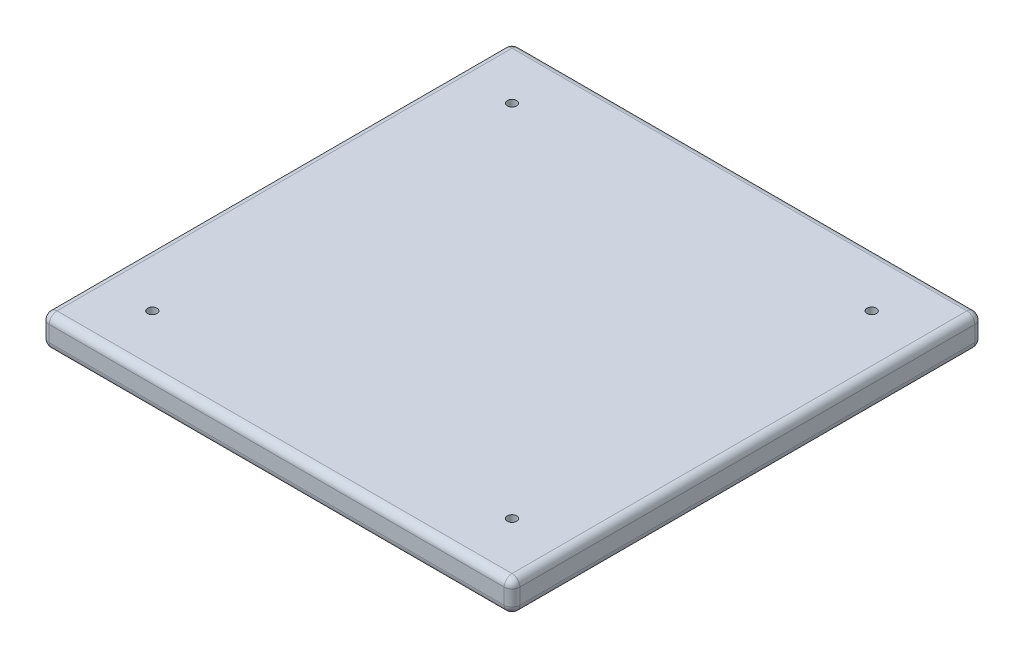
ISO-10303-21;
HEADER;
FILE_DESCRIPTION(('STEP AP214'),'2;1');
FILE_NAME('part.step','',(''),(''),'','','');
FILE_SCHEMA(('AUTOMOTIVE_DESIGN { 1 0 10303 214 1 1 1 1 }'));
ENDSEC;
DATA;
#1=APPLICATION_CONTEXT('core data for automotive mechanical design processes');
#2=APPLICATION_PROTOCOL_DEFINITION('international standard','automotive_design',2000,#1);
#3=PRODUCT_CONTEXT('',#1,'mechanical');
#4=PRODUCT('Part','Part','',(#3));
#5=PRODUCT_RELATED_PRODUCT_CATEGORY('part','',(#4));
#6=PRODUCT_DEFINITION_FORMATION('','',#4);
#7=PRODUCT_DEFINITION_CONTEXT('part definition',#1,'design');
#8=PRODUCT_DEFINITION('design','',#6,#7);
#9=PRODUCT_DEFINITION_SHAPE('','',#8);
#10=(LENGTH_UNIT() NAMED_UNIT(*) SI_UNIT(.MILLI.,.METRE.));
#11=(NAMED_UNIT(*) PLANE_ANGLE_UNIT() SI_UNIT($,.RADIAN.));
#12=(NAMED_UNIT(*) SI_UNIT($,.STERADIAN.) SOLID_ANGLE_UNIT());
#13=UNCERTAINTY_MEASURE_WITH_UNIT(LENGTH_MEASURE(1.E-05),#10,'distance_accuracy_value','');
#14=(GEOMETRIC_REPRESENTATION_CONTEXT(3) GLOBAL_UNCERTAINTY_ASSIGNED_CONTEXT((#13)) GLOBAL_UNIT_ASSIGNED_CONTEXT((#10,
#11,#12)) REPRESENTATION_CONTEXT('',''));
#15=CARTESIAN_POINT('',(0.,0.,0.));
#16=DIRECTION('',(0.,0.,1.));
#17=DIRECTION('',(1.,0.,0.));
#18=AXIS2_PLACEMENT_3D('',#15,#16,#17);
#19=CARTESIAN_POINT('',(75.,10.,-75.));
#20=DIRECTION('',(-1.,0.,0.));
#21=DIRECTION('',(0.,0.,1.));
#22=AXIS2_PLACEMENT_3D('',#19,#20,#21);
#23=PLANE('',#22);
#24=DIRECTION('',(0.,0.,-1.));
#25=VECTOR('',#24,1.);
#26=CARTESIAN_POINT('',(75.,7.5,75.));
#27=LINE('',#26,#25);
#28=CARTESIAN_POINT('',(75.,7.5,-72.5));
#29=VERTEX_POINT('',#28);
#30=CARTESIAN_POINT('',(75.,7.5,72.5));
#31=VERTEX_POINT('',#30);
#32=EDGE_CURVE('E59',#29,#31,#27,.F.);
#33=ORIENTED_EDGE('',*,*,#32,.T.);
#34=DIRECTION('',(0.,-1.,0.));
#35=VECTOR('',#34,1.);
#36=CARTESIAN_POINT('',(75.,10.,72.5));
#37=LINE('',#36,#35);
#38=CARTESIAN_POINT('',(75.,2.5,72.5));
#39=VERTEX_POINT('',#38);
#40=EDGE_CURVE('E11',#31,#39,#37,.T.);
#41=ORIENTED_EDGE('',*,*,#40,.T.);
#42=DIRECTION('',(0.,0.,-1.));
#43=VECTOR('',#42,1.);
#44=CARTESIAN_POINT('',(75.,2.5,-75.));
#45=LINE('',#44,#43);
#46=CARTESIAN_POINT('',(75.,2.5,-72.5));
#47=VERTEX_POINT('',#46);
#48=EDGE_CURVE('E235',#39,#47,#45,.T.);
#49=ORIENTED_EDGE('',*,*,#48,.T.);
#50=DIRECTION('',(0.,-1.,0.));
#51=VECTOR('',#50,1.);
#52=CARTESIAN_POINT('',(75.,10.,-72.5));
#53=LINE('',#52,#51);
#54=EDGE_CURVE('E70',#47,#29,#53,.F.);
#55=ORIENTED_EDGE('',*,*,#54,.T.);
#56=EDGE_LOOP('',(#33,#41,#49,#55));
#57=FACE_BOUND('',#56,.T.);
#58=ADVANCED_FACE('F49',(#57),#23,.F.);
#59=CARTESIAN_POINT('',(-75.,10.,-75.));
#60=DIRECTION('',(0.,0.,1.));
#61=DIRECTION('',(1.,0.,0.));
#62=AXIS2_PLACEMENT_3D('',#59,#60,#61);
#63=PLANE('',#62);
#64=DIRECTION('',(-1.,0.,0.));
#65=VECTOR('',#64,1.);
#66=CARTESIAN_POINT('',(-75.,2.5,-75.));
#67=LINE('',#66,#65);
#68=CARTESIAN_POINT('',(72.5,2.5,-75.));
#69=VERTEX_POINT('',#68);
#70=CARTESIAN_POINT('',(-72.5,2.5,-75.));
#71=VERTEX_POINT('',#70);
#72=EDGE_CURVE('E212',#69,#71,#67,.T.);
#73=ORIENTED_EDGE('',*,*,#72,.T.);
#74=DIRECTION('',(0.,-1.,0.));
#75=VECTOR('',#74,1.);
#76=CARTESIAN_POINT('',(-72.5,10.,-75.));
#77=LINE('',#76,#75);
#78=CARTESIAN_POINT('',(-72.5,7.5,-75.));
#79=VERTEX_POINT('',#78);
#80=EDGE_CURVE('E219',#71,#79,#77,.F.);
#81=ORIENTED_EDGE('',*,*,#80,.T.);
#82=DIRECTION('',(-1.,0.,0.));
#83=VECTOR('',#82,1.);
#84=CARTESIAN_POINT('',(75.,7.5,-75.));
#85=LINE('',#84,#83);
#86=CARTESIAN_POINT('',(72.5,7.5,-75.));
#87=VERTEX_POINT('',#86);
#88=EDGE_CURVE('E215',#79,#87,#85,.F.);
#89=ORIENTED_EDGE('',*,*,#88,.T.);
#90=DIRECTION('',(0.,-1.,0.));
#91=VECTOR('',#90,1.);
#92=CARTESIAN_POINT('',(72.5,10.,-75.));
#93=LINE('',#92,#91);
#94=EDGE_CURVE('E209',#87,#69,#93,.T.);
#95=ORIENTED_EDGE('',*,*,#94,.T.);
#96=EDGE_LOOP('',(#73,#81,#89,#95));
#97=FACE_BOUND('',#96,.T.);
#98=ADVANCED_FACE('F378',(#97),#63,.F.);
#99=CARTESIAN_POINT('',(-75.,10.,-75.));
#100=DIRECTION('',(1.,0.,0.));
#101=DIRECTION('',(0.,0.,-1.));
#102=AXIS2_PLACEMENT_3D('',#99,#100,#101);
#103=PLANE('',#102);
#104=DIRECTION('',(0.,0.,1.));
#105=VECTOR('',#104,1.);
#106=CARTESIAN_POINT('',(-75.,7.5,-75.));
#107=LINE('',#106,#105);
#108=CARTESIAN_POINT('',(-75.,7.5,72.5));
#109=VERTEX_POINT('',#108);
#110=CARTESIAN_POINT('',(-75.,7.5,-72.5));
#111=VERTEX_POINT('',#110);
#112=EDGE_CURVE('E228',#109,#111,#107,.F.);
#113=ORIENTED_EDGE('',*,*,#112,.T.);
#114=DIRECTION('',(0.,-1.,0.));
#115=VECTOR('',#114,1.);
#116=CARTESIAN_POINT('',(-75.,10.,-72.5));
#117=LINE('',#116,#115);
#118=CARTESIAN_POINT('',(-75.,2.5,-72.5));
#119=VERTEX_POINT('',#118);
#120=EDGE_CURVE('E231',#111,#119,#117,.T.);
#121=ORIENTED_EDGE('',*,*,#120,.T.);
#122=DIRECTION('',(0.,0.,1.));
#123=VECTOR('',#122,1.);
#124=CARTESIAN_POINT('',(-75.,2.5,-75.));
#125=LINE('',#124,#123);
#126=CARTESIAN_POINT('',(-75.,2.5,72.5));
#127=VERTEX_POINT('',#126);
#128=EDGE_CURVE('E222',#119,#127,#125,.T.);
#129=ORIENTED_EDGE('',*,*,#128,.T.);
#130=DIRECTION('',(0.,-1.,0.));
#131=VECTOR('',#130,1.);
#132=CARTESIAN_POINT('',(-75.,10.,72.5));
#133=LINE('',#132,#131);
#134=EDGE_CURVE('E225',#127,#109,#133,.F.);
#135=ORIENTED_EDGE('',*,*,#134,.T.);
#136=EDGE_LOOP('',(#113,#121,#129,#135));
#137=FACE_BOUND('',#136,.T.);
#138=ADVANCED_FACE('F383',(#137),#103,.F.);
#139=CARTESIAN_POINT('',(-75.,10.,75.));
#140=DIRECTION('',(0.,0.,-1.));
#141=DIRECTION('',(-1.,0.,0.));
#142=AXIS2_PLACEMENT_3D('',#139,#140,#141);
#143=PLANE('',#142);
#144=DIRECTION('',(1.,0.,0.));
#145=VECTOR('',#144,1.);
#146=CARTESIAN_POINT('',(-75.,7.5,75.));
#147=LINE('',#146,#145);
#148=CARTESIAN_POINT('',(72.5,7.5,75.));
#149=VERTEX_POINT('',#148);
#150=CARTESIAN_POINT('',(-72.5,7.5,75.));
#151=VERTEX_POINT('',#150);
#152=EDGE_CURVE('E146',#149,#151,#147,.F.);
#153=ORIENTED_EDGE('',*,*,#152,.T.);
#154=DIRECTION('',(0.,-1.,0.));
#155=VECTOR('',#154,1.);
#156=CARTESIAN_POINT('',(-72.5,10.,75.));
#157=LINE('',#156,#155);
#158=CARTESIAN_POINT('',(-72.5,2.5,75.));
#159=VERTEX_POINT('',#158);
#160=EDGE_CURVE('E193',#151,#159,#157,.T.);
#161=ORIENTED_EDGE('',*,*,#160,.T.);
#162=DIRECTION('',(1.,0.,0.));
#163=VECTOR('',#162,1.);
#164=CARTESIAN_POINT('',(-75.,2.5,75.));
#165=LINE('',#164,#163);
#166=CARTESIAN_POINT('',(72.5,2.5,75.));
#167=VERTEX_POINT('',#166);
#168=EDGE_CURVE('E188',#159,#167,#165,.T.);
#169=ORIENTED_EDGE('',*,*,#168,.T.);
#170=DIRECTION('',(0.,-1.,0.));
#171=VECTOR('',#170,1.);
#172=CARTESIAN_POINT('',(72.5,10.,75.));
#173=LINE('',#172,#171);
#174=EDGE_CURVE('E182',#167,#149,#173,.F.);
#175=ORIENTED_EDGE('',*,*,#174,.T.);
#176=EDGE_LOOP('',(#153,#161,#169,#175));
#177=FACE_BOUND('',#176,.T.);
#178=ADVANCED_FACE('F373',(#177),#143,.F.);
#179=CARTESIAN_POINT('',(0.,10.,0.));
#180=DIRECTION('',(0.,1.,0.));
#181=DIRECTION('',(0.,0.,1.));
#182=AXIS2_PLACEMENT_3D('',#179,#180,#181);
#183=PLANE('',#182);
#184=DIRECTION('',(-1.,0.,0.));
#185=VECTOR('',#184,1.);
#186=CARTESIAN_POINT('',(-75.,10.,-72.5));
#187=LINE('',#186,#185);
#188=CARTESIAN_POINT('',(72.5,10.,-72.5));
#189=VERTEX_POINT('',#188);
#190=CARTESIAN_POINT('',(-72.5,10.,-72.5));
#191=VERTEX_POINT('',#190);
#192=EDGE_CURVE('E170',#189,#191,#187,.T.);
#193=ORIENTED_EDGE('',*,*,#192,.T.);
#194=DIRECTION('',(0.,0.,1.));
#195=VECTOR('',#194,1.);
#196=CARTESIAN_POINT('',(-72.5,10.,75.));
#197=LINE('',#196,#195);
#198=CARTESIAN_POINT('',(-72.5,10.,72.5));
#199=VERTEX_POINT('',#198);
#200=EDGE_CURVE('E176',#191,#199,#197,.T.);
#201=ORIENTED_EDGE('',*,*,#200,.T.);
#202=DIRECTION('',(1.,0.,0.));
#203=VECTOR('',#202,1.);
#204=CARTESIAN_POINT('',(75.,10.,72.5));
#205=LINE('',#204,#203);
#206=CARTESIAN_POINT('',(72.5,10.,72.5));
#207=VERTEX_POINT('',#206);
#208=EDGE_CURVE('E144',#199,#207,#205,.T.);
#209=ORIENTED_EDGE('',*,*,#208,.T.);
#210=DIRECTION('',(0.,0.,-1.));
#211=VECTOR('',#210,1.);
#212=CARTESIAN_POINT('',(72.5,10.,-75.));
#213=LINE('',#212,#211);
#214=EDGE_CURVE('E163',#207,#189,#213,.T.);
#215=ORIENTED_EDGE('',*,*,#214,.T.);
#216=EDGE_LOOP('',(#193,#201,#209,#215));
#217=FACE_BOUND('',#216,.T.);
#218=CARTESIAN_POINT('',(-57.3223304703362,10.,57.3223304703364));
#219=DIRECTION('',(0.,1.,0.));
#220=DIRECTION('',(0.,0.,-1.));
#221=AXIS2_PLACEMENT_3D('',#218,#219,#220);
#222=CIRCLE('',#221,1.5);
#223=CARTESIAN_POINT('',(-57.3223304703362,10.,55.8223304703364));
#224=VERTEX_POINT('',#223);
#225=EDGE_CURVE('E320',#224,#224,#222,.T.);
#226=ORIENTED_EDGE('',*,*,#225,.F.);
#227=EDGE_LOOP('',(#226));
#228=FACE_BOUND('',#227,.T.);
#229=CARTESIAN_POINT('',(57.3223304703362,10.,57.3223304703364));
#230=DIRECTION('',(0.,-1.,0.));
#231=DIRECTION('',(0.,0.,-1.));
#232=AXIS2_PLACEMENT_3D('',#229,#230,#231);
#233=CIRCLE('',#232,1.5);
#234=CARTESIAN_POINT('',(57.3223304703362,10.,55.8223304703364));
#235=VERTEX_POINT('',#234);
#236=EDGE_CURVE('E333',#235,#235,#233,.T.);
#237=ORIENTED_EDGE('',*,*,#236,.T.);
#238=EDGE_LOOP('',(#237));
#239=FACE_BOUND('',#238,.T.);
#240=CARTESIAN_POINT('',(-57.3223304703363,10.,-57.3223304703363));
#241=DIRECTION('',(0.,-1.,0.));
#242=DIRECTION('',(0.,0.,1.));
#243=AXIS2_PLACEMENT_3D('',#240,#241,#242);
#244=CIRCLE('',#243,1.5);
#245=CARTESIAN_POINT('',(-57.3223304703363,10.,-55.8223304703363));
#246=VERTEX_POINT('',#245);
#247=EDGE_CURVE('E343',#246,#246,#244,.T.);
#248=ORIENTED_EDGE('',*,*,#247,.T.);
#249=EDGE_LOOP('',(#248));
#250=FACE_BOUND('',#249,.T.);
#251=CARTESIAN_POINT('',(57.3223304703362,10.,-57.3223304703364));
#252=DIRECTION('',(0.,1.,0.));
#253=DIRECTION('',(0.,0.,1.));
#254=AXIS2_PLACEMENT_3D('',#251,#252,#253);
#255=CIRCLE('',#254,1.5);
#256=CARTESIAN_POINT('',(57.3223304703362,10.,-55.8223304703364));
#257=VERTEX_POINT('',#256);
#258=EDGE_CURVE('E351',#257,#257,#255,.T.);
#259=ORIENTED_EDGE('',*,*,#258,.F.);
#260=EDGE_LOOP('',(#259));
#261=FACE_BOUND('',#260,.T.);
#262=ADVANCED_FACE('F173',(#217,#228,#239,#250,#261),#183,.T.);
#263=CARTESIAN_POINT('',(0.,0.,0.));
#264=DIRECTION('',(0.,1.,0.));
#265=DIRECTION('',(0.,0.,1.));
#266=AXIS2_PLACEMENT_3D('',#263,#264,#265);
#267=PLANE('',#266);
#268=DIRECTION('',(1.,0.,0.));
#269=VECTOR('',#268,1.);
#270=CARTESIAN_POINT('',(0.,0.,72.5));
#271=LINE('',#270,#269);
#272=CARTESIAN_POINT('',(72.5,0.,72.5));
#273=VERTEX_POINT('',#272);
#274=CARTESIAN_POINT('',(-72.5,0.,72.5));
#275=VERTEX_POINT('',#274);
#276=EDGE_CURVE('E202',#273,#275,#271,.F.);
#277=ORIENTED_EDGE('',*,*,#276,.T.);
#278=DIRECTION('',(0.,0.,1.));
#279=VECTOR('',#278,1.);
#280=CARTESIAN_POINT('',(-72.5,0.,0.));
#281=LINE('',#280,#279);
#282=CARTESIAN_POINT('',(-72.5,0.,-72.5));
#283=VERTEX_POINT('',#282);
#284=EDGE_CURVE('E206',#275,#283,#281,.F.);
#285=ORIENTED_EDGE('',*,*,#284,.T.);
#286=DIRECTION('',(-1.,0.,0.));
#287=VECTOR('',#286,1.);
#288=CARTESIAN_POINT('',(0.,0.,-72.5));
#289=LINE('',#288,#287);
#290=CARTESIAN_POINT('',(72.5,0.,-72.5));
#291=VERTEX_POINT('',#290);
#292=EDGE_CURVE('E199',#283,#291,#289,.F.);
#293=ORIENTED_EDGE('',*,*,#292,.T.);
#294=DIRECTION('',(0.,0.,-1.));
#295=VECTOR('',#294,1.);
#296=CARTESIAN_POINT('',(72.5,0.,0.));
#297=LINE('',#296,#295);
#298=EDGE_CURVE('E196',#291,#273,#297,.F.);
#299=ORIENTED_EDGE('',*,*,#298,.T.);
#300=EDGE_LOOP('',(#277,#285,#293,#299));
#301=FACE_BOUND('',#300,.T.);
#302=CARTESIAN_POINT('',(-57.3223304703362,0.,57.3223304703364));
#303=DIRECTION('',(0.,1.,0.));
#304=DIRECTION('',(0.,0.,1.));
#305=AXIS2_PLACEMENT_3D('',#302,#303,#304);
#306=CIRCLE('',#305,1.5);
#307=CARTESIAN_POINT('',(-57.3223304703362,0.,58.8223304703364));
#308=VERTEX_POINT('',#307);
#309=EDGE_CURVE('E327',#308,#308,#306,.F.);
#310=ORIENTED_EDGE('',*,*,#309,.F.);
#311=EDGE_LOOP('',(#310));
#312=FACE_BOUND('',#311,.T.);
#313=CARTESIAN_POINT('',(57.3223304703362,0.,57.3223304703364));
#314=DIRECTION('',(0.,1.,0.));
#315=DIRECTION('',(0.,0.,1.));
#316=AXIS2_PLACEMENT_3D('',#313,#314,#315);
#317=CIRCLE('',#316,1.5);
#318=CARTESIAN_POINT('',(57.3223304703362,0.,58.8223304703364));
#319=VERTEX_POINT('',#318);
#320=EDGE_CURVE('E339',#319,#319,#317,.T.);
#321=ORIENTED_EDGE('',*,*,#320,.T.);
#322=EDGE_LOOP('',(#321));
#323=FACE_BOUND('',#322,.T.);
#324=CARTESIAN_POINT('',(-57.3223304703363,0.,-57.3223304703363));
#325=DIRECTION('',(0.,1.,0.));
#326=DIRECTION('',(0.,0.,1.));
#327=AXIS2_PLACEMENT_3D('',#324,#325,#326);
#328=CIRCLE('',#327,1.5);
#329=CARTESIAN_POINT('',(-57.3223304703363,0.,-55.8223304703363));
#330=VERTEX_POINT('',#329);
#331=EDGE_CURVE('E347',#330,#330,#328,.T.);
#332=ORIENTED_EDGE('',*,*,#331,.T.);
#333=EDGE_LOOP('',(#332));
#334=FACE_BOUND('',#333,.T.);
#335=CARTESIAN_POINT('',(57.3223304703362,0.,-57.3223304703364));
#336=DIRECTION('',(0.,1.,0.));
#337=DIRECTION('',(0.,0.,1.));
#338=AXIS2_PLACEMENT_3D('',#335,#336,#337);
#339=CIRCLE('',#338,1.5);
#340=CARTESIAN_POINT('',(57.3223304703362,0.,-55.8223304703364));
#341=VERTEX_POINT('',#340);
#342=EDGE_CURVE('E171',#341,#341,#339,.F.);
#343=ORIENTED_EDGE('',*,*,#342,.F.);
#344=EDGE_LOOP('',(#343));
#345=FACE_BOUND('',#344,.T.);
#346=ADVANCED_FACE('F362',(#301,#312,#323,#334,#345),#267,.F.);
#347=CARTESIAN_POINT('',(57.3223304703362,-4.24264068711929,-57.3223304703364));
#348=DIRECTION('',(0.,1.,0.));
#349=DIRECTION('',(0.,0.,1.));
#350=AXIS2_PLACEMENT_3D('',#347,#348,#349);
#351=CYLINDRICAL_SURFACE('',#350,1.5);
#352=ORIENTED_EDGE('',*,*,#342,.T.);
#353=EDGE_LOOP('',(#352));
#354=FACE_BOUND('',#353,.T.);
#355=ORIENTED_EDGE('',*,*,#258,.T.);
#356=EDGE_LOOP('',(#355));
#357=FACE_BOUND('',#356,.T.);
#358=ADVANCED_FACE('F359',(#354,#357),#351,.F.);
#359=CARTESIAN_POINT('',(-57.3223304703363,-4.24264068711929,-57.3223304703363));
#360=DIRECTION('',(0.,1.,0.));
#361=DIRECTION('',(0.,0.,1.));
#362=AXIS2_PLACEMENT_3D('',#359,#360,#361);
#363=CYLINDRICAL_SURFACE('',#362,1.5);
#364=ORIENTED_EDGE('',*,*,#331,.F.);
#365=EDGE_LOOP('',(#364));
#366=FACE_BOUND('',#365,.T.);
#367=ORIENTED_EDGE('',*,*,#247,.F.);
#368=EDGE_LOOP('',(#367));
#369=FACE_BOUND('',#368,.T.);
#370=ADVANCED_FACE('F371',(#366,#369),#363,.F.);
#371=CARTESIAN_POINT('',(57.3223304703362,-4.24264068711929,57.3223304703364));
#372=DIRECTION('',(0.,1.,0.));
#373=DIRECTION('',(0.,0.,1.));
#374=AXIS2_PLACEMENT_3D('',#371,#372,#373);
#375=CYLINDRICAL_SURFACE('',#374,1.5);
#376=ORIENTED_EDGE('',*,*,#320,.F.);
#377=EDGE_LOOP('',(#376));
#378=FACE_BOUND('',#377,.T.);
#379=ORIENTED_EDGE('',*,*,#236,.F.);
#380=EDGE_LOOP('',(#379));
#381=FACE_BOUND('',#380,.T.);
#382=ADVANCED_FACE('F512',(#378,#381),#375,.F.);
#383=CARTESIAN_POINT('',(-57.3223304703362,-4.24264068711929,57.3223304703364));
#384=DIRECTION('',(0.,1.,0.));
#385=DIRECTION('',(0.,0.,1.));
#386=AXIS2_PLACEMENT_3D('',#383,#384,#385);
#387=CYLINDRICAL_SURFACE('',#386,1.5);
#388=ORIENTED_EDGE('',*,*,#309,.T.);
#389=EDGE_LOOP('',(#388));
#390=FACE_BOUND('',#389,.T.);
#391=ORIENTED_EDGE('',*,*,#225,.T.);
#392=EDGE_LOOP('',(#391));
#393=FACE_BOUND('',#392,.T.);
#394=ADVANCED_FACE('F456',(#390,#393),#387,.F.);
#395=CARTESIAN_POINT('',(-75.,2.5,-72.5));
#396=DIRECTION('',(-1.,0.,0.));
#397=DIRECTION('',(0.,0.,1.));
#398=AXIS2_PLACEMENT_3D('',#395,#396,#397);
#399=CYLINDRICAL_SURFACE('',#398,2.5);
#400=CARTESIAN_POINT('',(-72.5,2.5,-72.5));
#401=DIRECTION('',(-1.,0.,0.));
#402=DIRECTION('',(0.,0.,1.));
#403=AXIS2_PLACEMENT_3D('',#400,#401,#402);
#404=CIRCLE('',#403,2.5);
#405=EDGE_CURVE('E53',#71,#283,#404,.T.);
#406=ORIENTED_EDGE('',*,*,#405,.F.);
#407=ORIENTED_EDGE('',*,*,#72,.F.);
#408=CARTESIAN_POINT('',(72.5,2.5,-72.5));
#409=DIRECTION('',(1.,0.,0.));
#410=DIRECTION('',(0.,0.,-1.));
#411=AXIS2_PLACEMENT_3D('',#408,#409,#410);
#412=CIRCLE('',#411,2.5);
#413=EDGE_CURVE('E311',#291,#69,#412,.T.);
#414=ORIENTED_EDGE('',*,*,#413,.F.);
#415=ORIENTED_EDGE('',*,*,#292,.F.);
#416=EDGE_LOOP('',(#406,#407,#414,#415));
#417=FACE_BOUND('',#416,.T.);
#418=ADVANCED_FACE('F51',(#417),#399,.T.);
#419=CARTESIAN_POINT('',(-72.5,2.5,-72.5));
#420=DIRECTION('',(0.,-1.,0.));
#421=DIRECTION('',(0.,0.,-1.));
#422=AXIS2_PLACEMENT_3D('',#419,#420,#421);
#423=SPHERICAL_SURFACE('',#422,2.5);
#424=CARTESIAN_POINT('',(-72.5,2.5,-72.5));
#425=DIRECTION('',(0.,-1.,0.));
#426=DIRECTION('',(0.,0.,-1.));
#427=AXIS2_PLACEMENT_3D('',#424,#425,#426);
#428=CIRCLE('',#427,2.5);
#429=EDGE_CURVE('E304',#71,#119,#428,.F.);
#430=ORIENTED_EDGE('',*,*,#429,.F.);
#431=ORIENTED_EDGE('',*,*,#405,.T.);
#432=CARTESIAN_POINT('',(-72.5,2.5,-72.5));
#433=DIRECTION('',(0.,0.,-1.));
#434=DIRECTION('',(-1.,0.,0.));
#435=AXIS2_PLACEMENT_3D('',#432,#433,#434);
#436=CIRCLE('',#435,2.5);
#437=EDGE_CURVE('E308',#119,#283,#436,.F.);
#438=ORIENTED_EDGE('',*,*,#437,.F.);
#439=EDGE_LOOP('',(#430,#431,#438));
#440=FACE_BOUND('',#439,.T.);
#441=ADVANCED_FACE('F452',(#440),#423,.T.);
#442=CARTESIAN_POINT('',(72.5,2.5,-72.5));
#443=DIRECTION('',(0.,0.,-1.));
#444=DIRECTION('',(-1.,0.,0.));
#445=AXIS2_PLACEMENT_3D('',#442,#443,#444);
#446=SPHERICAL_SURFACE('',#445,2.5);
#447=CARTESIAN_POINT('',(72.5,2.5,-72.5));
#448=DIRECTION('',(0.,0.,-1.));
#449=DIRECTION('',(-1.,0.,0.));
#450=AXIS2_PLACEMENT_3D('',#447,#448,#449);
#451=CIRCLE('',#450,2.5);
#452=EDGE_CURVE('E296',#291,#47,#451,.F.);
#453=ORIENTED_EDGE('',*,*,#452,.F.);
#454=ORIENTED_EDGE('',*,*,#413,.T.);
#455=CARTESIAN_POINT('',(72.5,2.5,-72.5));
#456=DIRECTION('',(0.,-1.,0.));
#457=DIRECTION('',(0.,0.,-1.));
#458=AXIS2_PLACEMENT_3D('',#455,#456,#457);
#459=CIRCLE('',#458,2.5);
#460=EDGE_CURVE('E300',#47,#69,#459,.F.);
#461=ORIENTED_EDGE('',*,*,#460,.F.);
#462=EDGE_LOOP('',(#453,#454,#461));
#463=FACE_BOUND('',#462,.T.);
#464=ADVANCED_FACE('F449',(#463),#446,.T.);
#465=CARTESIAN_POINT('',(-72.5,2.5,-75.));
#466=DIRECTION('',(0.,0.,1.));
#467=DIRECTION('',(1.,0.,0.));
#468=AXIS2_PLACEMENT_3D('',#465,#466,#467);
#469=CYLINDRICAL_SURFACE('',#468,2.5);
#470=ORIENTED_EDGE('',*,*,#437,.T.);
#471=ORIENTED_EDGE('',*,*,#284,.F.);
#472=CARTESIAN_POINT('',(-72.5,2.5,72.5));
#473=DIRECTION('',(0.,0.,1.));
#474=DIRECTION('',(1.,0.,0.));
#475=AXIS2_PLACEMENT_3D('',#472,#473,#474);
#476=CIRCLE('',#475,2.5);
#477=EDGE_CURVE('E289',#127,#275,#476,.T.);
#478=ORIENTED_EDGE('',*,*,#477,.F.);
#479=ORIENTED_EDGE('',*,*,#128,.F.);
#480=EDGE_LOOP('',(#470,#471,#478,#479));
#481=FACE_BOUND('',#480,.T.);
#482=ADVANCED_FACE('F445',(#481),#469,.T.);
#483=CARTESIAN_POINT('',(-72.5,10.,-72.5));
#484=DIRECTION('',(0.,-1.,0.));
#485=DIRECTION('',(0.,0.,-1.));
#486=AXIS2_PLACEMENT_3D('',#483,#484,#485);
#487=CYLINDRICAL_SURFACE('',#486,2.5);
#488=ORIENTED_EDGE('',*,*,#429,.T.);
#489=ORIENTED_EDGE('',*,*,#120,.F.);
#490=CARTESIAN_POINT('',(-72.5,7.5,-72.5));
#491=DIRECTION('',(0.,1.,0.));
#492=DIRECTION('',(0.,0.,1.));
#493=AXIS2_PLACEMENT_3D('',#490,#491,#492);
#494=CIRCLE('',#493,2.5);
#495=EDGE_CURVE('E285',#79,#111,#494,.T.);
#496=ORIENTED_EDGE('',*,*,#495,.F.);
#497=ORIENTED_EDGE('',*,*,#80,.F.);
#498=EDGE_LOOP('',(#488,#489,#496,#497));
#499=FACE_BOUND('',#498,.T.);
#500=ADVANCED_FACE('F441',(#499),#487,.T.);
#501=CARTESIAN_POINT('',(0.,7.5,-72.5));
#502=DIRECTION('',(1.,0.,0.));
#503=DIRECTION('',(0.,0.,-1.));
#504=AXIS2_PLACEMENT_3D('',#501,#502,#503);
#505=CYLINDRICAL_SURFACE('',#504,2.5);
#506=CARTESIAN_POINT('',(72.5,7.5,-72.5));
#507=DIRECTION('',(1.,0.,0.));
#508=DIRECTION('',(0.,1.,0.));
#509=AXIS2_PLACEMENT_3D('',#506,#507,#508);
#510=CIRCLE('',#509,2.5);
#511=EDGE_CURVE('E277',#87,#189,#510,.T.);
#512=ORIENTED_EDGE('',*,*,#511,.F.);
#513=ORIENTED_EDGE('',*,*,#88,.F.);
#514=CARTESIAN_POINT('',(-72.5,7.5,-72.5));
#515=DIRECTION('',(-1.,0.,0.));
#516=DIRECTION('',(0.,0.,1.));
#517=AXIS2_PLACEMENT_3D('',#514,#515,#516);
#518=CIRCLE('',#517,2.5);
#519=EDGE_CURVE('E281',#191,#79,#518,.T.);
#520=ORIENTED_EDGE('',*,*,#519,.F.);
#521=ORIENTED_EDGE('',*,*,#192,.F.);
#522=EDGE_LOOP('',(#512,#513,#520,#521));
#523=FACE_BOUND('',#522,.T.);
#524=ADVANCED_FACE('F437',(#523),#505,.T.);
#525=CARTESIAN_POINT('',(72.5,10.,-72.5));
#526=DIRECTION('',(0.,-1.,0.));
#527=DIRECTION('',(0.,0.,-1.));
#528=AXIS2_PLACEMENT_3D('',#525,#526,#527);
#529=CYLINDRICAL_SURFACE('',#528,2.5);
#530=ORIENTED_EDGE('',*,*,#460,.T.);
#531=ORIENTED_EDGE('',*,*,#94,.F.);
#532=CARTESIAN_POINT('',(72.5,7.5,-72.5));
#533=DIRECTION('',(0.,1.,0.));
#534=DIRECTION('',(0.,0.,1.));
#535=AXIS2_PLACEMENT_3D('',#532,#533,#534);
#536=CIRCLE('',#535,2.5);
#537=EDGE_CURVE('E274',#29,#87,#536,.T.);
#538=ORIENTED_EDGE('',*,*,#537,.F.);
#539=ORIENTED_EDGE('',*,*,#54,.F.);
#540=EDGE_LOOP('',(#530,#531,#538,#539));
#541=FACE_BOUND('',#540,.T.);
#542=ADVANCED_FACE('F433',(#541),#529,.T.);
#543=CARTESIAN_POINT('',(72.5,2.5,-75.));
#544=DIRECTION('',(0.,0.,-1.));
#545=DIRECTION('',(-1.,0.,0.));
#546=AXIS2_PLACEMENT_3D('',#543,#544,#545);
#547=CYLINDRICAL_SURFACE('',#546,2.5);
#548=ORIENTED_EDGE('',*,*,#452,.T.);
#549=ORIENTED_EDGE('',*,*,#48,.F.);
#550=CARTESIAN_POINT('',(72.5,2.5,72.5));
#551=DIRECTION('',(0.,0.,1.));
#552=DIRECTION('',(1.,0.,0.));
#553=AXIS2_PLACEMENT_3D('',#550,#551,#552);
#554=CIRCLE('',#553,2.5);
#555=EDGE_CURVE('E270',#273,#39,#554,.T.);
#556=ORIENTED_EDGE('',*,*,#555,.F.);
#557=ORIENTED_EDGE('',*,*,#298,.F.);
#558=EDGE_LOOP('',(#548,#549,#556,#557));
#559=FACE_BOUND('',#558,.T.);
#560=ADVANCED_FACE('F429',(#559),#547,.T.);
#561=CARTESIAN_POINT('',(-75.,2.5,72.5));
#562=DIRECTION('',(1.,0.,0.));
#563=DIRECTION('',(0.,0.,-1.));
#564=AXIS2_PLACEMENT_3D('',#561,#562,#563);
#565=CYLINDRICAL_SURFACE('',#564,2.5);
#566=CARTESIAN_POINT('',(-72.5,2.5,72.5));
#567=DIRECTION('',(-1.,0.,0.));
#568=DIRECTION('',(0.,0.,1.));
#569=AXIS2_PLACEMENT_3D('',#566,#567,#568);
#570=CIRCLE('',#569,2.5);
#571=EDGE_CURVE('E292',#275,#159,#570,.T.);
#572=ORIENTED_EDGE('',*,*,#571,.F.);
#573=ORIENTED_EDGE('',*,*,#276,.F.);
#574=CARTESIAN_POINT('',(72.5,2.5,72.5));
#575=DIRECTION('',(1.,0.,0.));
#576=DIRECTION('',(0.,0.,-1.));
#577=AXIS2_PLACEMENT_3D('',#574,#575,#576);
#578=CIRCLE('',#577,2.5);
#579=EDGE_CURVE('E266',#167,#273,#578,.T.);
#580=ORIENTED_EDGE('',*,*,#579,.F.);
#581=ORIENTED_EDGE('',*,*,#168,.F.);
#582=EDGE_LOOP('',(#572,#573,#580,#581));
#583=FACE_BOUND('',#582,.T.);
#584=ADVANCED_FACE('F425',(#583),#565,.T.);
#585=CARTESIAN_POINT('',(-72.5,2.5,72.5));
#586=DIRECTION('',(0.,-1.,0.));
#587=DIRECTION('',(0.,0.,-1.));
#588=AXIS2_PLACEMENT_3D('',#585,#586,#587);
#589=SPHERICAL_SURFACE('',#588,2.5);
#590=ORIENTED_EDGE('',*,*,#477,.T.);
#591=ORIENTED_EDGE('',*,*,#571,.T.);
#592=CARTESIAN_POINT('',(-72.5,2.5,72.5));
#593=DIRECTION('',(0.,-1.,0.));
#594=DIRECTION('',(0.,0.,-1.));
#595=AXIS2_PLACEMENT_3D('',#592,#593,#594);
#596=CIRCLE('',#595,2.5);
#597=EDGE_CURVE('E262',#127,#159,#596,.F.);
#598=ORIENTED_EDGE('',*,*,#597,.F.);
#599=EDGE_LOOP('',(#590,#591,#598));
#600=FACE_BOUND('',#599,.T.);
#601=ADVANCED_FACE('F421',(#600),#589,.T.);
#602=CARTESIAN_POINT('',(-72.5,7.5,-72.5));
#603=DIRECTION('',(0.,0.,-1.));
#604=DIRECTION('',(-1.,0.,0.));
#605=AXIS2_PLACEMENT_3D('',#602,#603,#604);
#606=SPHERICAL_SURFACE('',#605,2.5);
#607=ORIENTED_EDGE('',*,*,#519,.T.);
#608=ORIENTED_EDGE('',*,*,#495,.T.);
#609=CARTESIAN_POINT('',(-72.5,7.5,-72.5));
#610=DIRECTION('',(0.,0.,-1.));
#611=DIRECTION('',(-1.,0.,0.));
#612=AXIS2_PLACEMENT_3D('',#609,#610,#611);
#613=CIRCLE('',#612,2.5);
#614=EDGE_CURVE('E258',#191,#111,#613,.F.);
#615=ORIENTED_EDGE('',*,*,#614,.F.);
#616=EDGE_LOOP('',(#607,#608,#615));
#617=FACE_BOUND('',#616,.T.);
#618=ADVANCED_FACE('F417',(#617),#606,.T.);
#619=CARTESIAN_POINT('',(72.5,7.5,-72.5));
#620=DIRECTION('',(0.,0.,-1.));
#621=DIRECTION('',(-1.,0.,0.));
#622=AXIS2_PLACEMENT_3D('',#619,#620,#621);
#623=SPHERICAL_SURFACE('',#622,2.5);
#624=ORIENTED_EDGE('',*,*,#537,.T.);
#625=ORIENTED_EDGE('',*,*,#511,.T.);
#626=CARTESIAN_POINT('',(72.5,7.5,-72.5));
#627=DIRECTION('',(0.,0.,-1.));
#628=DIRECTION('',(-1.,0.,0.));
#629=AXIS2_PLACEMENT_3D('',#626,#627,#628);
#630=CIRCLE('',#629,2.5);
#631=EDGE_CURVE('E166',#29,#189,#630,.F.);
#632=ORIENTED_EDGE('',*,*,#631,.F.);
#633=EDGE_LOOP('',(#624,#625,#632));
#634=FACE_BOUND('',#633,.T.);
#635=ADVANCED_FACE('F413',(#634),#623,.T.);
#636=CARTESIAN_POINT('',(72.5,2.5,72.5));
#637=DIRECTION('',(0.,-1.,0.));
#638=DIRECTION('',(0.,0.,-1.));
#639=AXIS2_PLACEMENT_3D('',#636,#637,#638);
#640=SPHERICAL_SURFACE('',#639,2.5);
#641=ORIENTED_EDGE('',*,*,#579,.T.);
#642=ORIENTED_EDGE('',*,*,#555,.T.);
#643=CARTESIAN_POINT('',(72.5,2.5,72.5));
#644=DIRECTION('',(0.,-1.,0.));
#645=DIRECTION('',(0.,0.,-1.));
#646=AXIS2_PLACEMENT_3D('',#643,#644,#645);
#647=CIRCLE('',#646,2.5);
#648=EDGE_CURVE('E253',#167,#39,#647,.F.);
#649=ORIENTED_EDGE('',*,*,#648,.F.);
#650=EDGE_LOOP('',(#641,#642,#649));
#651=FACE_BOUND('',#650,.T.);
#652=ADVANCED_FACE('F409',(#651),#640,.T.);
#653=CARTESIAN_POINT('',(-72.5,10.,72.5));
#654=DIRECTION('',(0.,-1.,0.));
#655=DIRECTION('',(0.,0.,-1.));
#656=AXIS2_PLACEMENT_3D('',#653,#654,#655);
#657=CYLINDRICAL_SURFACE('',#656,2.5);
#658=ORIENTED_EDGE('',*,*,#597,.T.);
#659=ORIENTED_EDGE('',*,*,#160,.F.);
#660=CARTESIAN_POINT('',(-72.5,7.5,72.5));
#661=DIRECTION('',(0.,1.,0.));
#662=DIRECTION('',(0.,0.,1.));
#663=AXIS2_PLACEMENT_3D('',#660,#661,#662);
#664=CIRCLE('',#663,2.5);
#665=EDGE_CURVE('E249',#109,#151,#664,.T.);
#666=ORIENTED_EDGE('',*,*,#665,.F.);
#667=ORIENTED_EDGE('',*,*,#134,.F.);
#668=EDGE_LOOP('',(#658,#659,#666,#667));
#669=FACE_BOUND('',#668,.T.);
#670=ADVANCED_FACE('F405',(#669),#657,.T.);
#671=CARTESIAN_POINT('',(-72.5,7.5,0.));
#672=DIRECTION('',(0.,0.,-1.));
#673=DIRECTION('',(-1.,0.,0.));
#674=AXIS2_PLACEMENT_3D('',#671,#672,#673);
#675=CYLINDRICAL_SURFACE('',#674,2.5);
#676=ORIENTED_EDGE('',*,*,#614,.T.);
#677=ORIENTED_EDGE('',*,*,#112,.F.);
#678=CARTESIAN_POINT('',(-72.5,7.5,72.5));
#679=DIRECTION('',(0.,0.,1.));
#680=DIRECTION('',(1.,0.,0.));
#681=AXIS2_PLACEMENT_3D('',#678,#679,#680);
#682=CIRCLE('',#681,2.5);
#683=EDGE_CURVE('E160',#199,#109,#682,.T.);
#684=ORIENTED_EDGE('',*,*,#683,.F.);
#685=ORIENTED_EDGE('',*,*,#200,.F.);
#686=EDGE_LOOP('',(#676,#677,#684,#685));
#687=FACE_BOUND('',#686,.T.);
#688=ADVANCED_FACE('F402',(#687),#675,.T.);
#689=CARTESIAN_POINT('',(72.5,7.5,0.));
#690=DIRECTION('',(0.,0.,1.));
#691=DIRECTION('',(1.,0.,0.));
#692=AXIS2_PLACEMENT_3D('',#689,#690,#691);
#693=CYLINDRICAL_SURFACE('',#692,2.5);
#694=ORIENTED_EDGE('',*,*,#631,.T.);
#695=ORIENTED_EDGE('',*,*,#214,.F.);
#696=CARTESIAN_POINT('',(72.5,7.5,72.5));
#697=DIRECTION('',(0.,0.,1.));
#698=DIRECTION('',(0.,-1.,0.));
#699=AXIS2_PLACEMENT_3D('',#696,#697,#698);
#700=CIRCLE('',#699,2.5);
#701=EDGE_CURVE('E153',#31,#207,#700,.T.);
#702=ORIENTED_EDGE('',*,*,#701,.F.);
#703=ORIENTED_EDGE('',*,*,#32,.F.);
#704=EDGE_LOOP('',(#694,#695,#702,#703));
#705=FACE_BOUND('',#704,.T.);
#706=ADVANCED_FACE('F164',(#705),#693,.T.);
#707=CARTESIAN_POINT('',(72.5,10.,72.5));
#708=DIRECTION('',(0.,-1.,0.));
#709=DIRECTION('',(0.,0.,-1.));
#710=AXIS2_PLACEMENT_3D('',#707,#708,#709);
#711=CYLINDRICAL_SURFACE('',#710,2.5);
#712=ORIENTED_EDGE('',*,*,#648,.T.);
#713=ORIENTED_EDGE('',*,*,#40,.F.);
#714=CARTESIAN_POINT('',(72.5,7.5,72.5));
#715=DIRECTION('',(0.,1.,0.));
#716=DIRECTION('',(0.,0.,1.));
#717=AXIS2_PLACEMENT_3D('',#714,#715,#716);
#718=CIRCLE('',#717,2.5);
#719=EDGE_CURVE('E157',#149,#31,#718,.T.);
#720=ORIENTED_EDGE('',*,*,#719,.F.);
#721=ORIENTED_EDGE('',*,*,#174,.F.);
#722=EDGE_LOOP('',(#712,#713,#720,#721));
#723=FACE_BOUND('',#722,.T.);
#724=ADVANCED_FACE('F395',(#723),#711,.T.);
#725=CARTESIAN_POINT('',(-72.5,7.5,72.5));
#726=DIRECTION('',(-1.,0.,0.));
#727=DIRECTION('',(0.,0.,1.));
#728=AXIS2_PLACEMENT_3D('',#725,#726,#727);
#729=SPHERICAL_SURFACE('',#728,2.5);
#730=ORIENTED_EDGE('',*,*,#683,.T.);
#731=ORIENTED_EDGE('',*,*,#665,.T.);
#732=CARTESIAN_POINT('',(-72.5,7.5,72.5));
#733=DIRECTION('',(-1.,0.,0.));
#734=DIRECTION('',(0.,-1.,0.));
#735=AXIS2_PLACEMENT_3D('',#732,#733,#734);
#736=CIRCLE('',#735,2.5);
#737=EDGE_CURVE('E150',#199,#151,#736,.F.);
#738=ORIENTED_EDGE('',*,*,#737,.F.);
#739=EDGE_LOOP('',(#730,#731,#738));
#740=FACE_BOUND('',#739,.T.);
#741=ADVANCED_FACE('F392',(#740),#729,.T.);
#742=CARTESIAN_POINT('',(72.5,7.5,72.5));
#743=DIRECTION('',(1.,0.,0.));
#744=DIRECTION('',(0.,0.,-1.));
#745=AXIS2_PLACEMENT_3D('',#742,#743,#744);
#746=SPHERICAL_SURFACE('',#745,2.5);
#747=ORIENTED_EDGE('',*,*,#719,.T.);
#748=ORIENTED_EDGE('',*,*,#701,.T.);
#749=CARTESIAN_POINT('',(72.5,7.5,72.5));
#750=DIRECTION('',(1.,0.,0.));
#751=DIRECTION('',(0.,0.,-1.));
#752=AXIS2_PLACEMENT_3D('',#749,#750,#751);
#753=CIRCLE('',#752,2.5);
#754=EDGE_CURVE('E140',#149,#207,#753,.F.);
#755=ORIENTED_EDGE('',*,*,#754,.F.);
#756=EDGE_LOOP('',(#747,#748,#755));
#757=FACE_BOUND('',#756,.T.);
#758=ADVANCED_FACE('F155',(#757),#746,.T.);
#759=CARTESIAN_POINT('',(0.,7.5,72.5));
#760=DIRECTION('',(-1.,0.,0.));
#761=DIRECTION('',(0.,0.,1.));
#762=AXIS2_PLACEMENT_3D('',#759,#760,#761);
#763=CYLINDRICAL_SURFACE('',#762,2.5);
#764=ORIENTED_EDGE('',*,*,#737,.T.);
#765=ORIENTED_EDGE('',*,*,#152,.F.);
#766=ORIENTED_EDGE('',*,*,#754,.T.);
#767=ORIENTED_EDGE('',*,*,#208,.F.);
#768=EDGE_LOOP('',(#764,#765,#766,#767));
#769=FACE_BOUND('',#768,.T.);
#770=ADVANCED_FACE('F142',(#769),#763,.T.);
#771=CLOSED_SHELL('',(#58,#98,#138,#178,#262,#346,#358,#370,#382,#394,#418,#441,#464,#482,#500,
#524,#542,#560,#584,#601,#618,#635,#652,#670,#688,#706,#724,#741,#758,#770));
#772=MANIFOLD_SOLID_BREP('B2',#771);
#773=ADVANCED_BREP_SHAPE_REPRESENTATION('',(#18,#772),#14);
#774=SHAPE_DEFINITION_REPRESENTATION(#9,#773);
ENDSEC;
END-ISO-10303-21;
